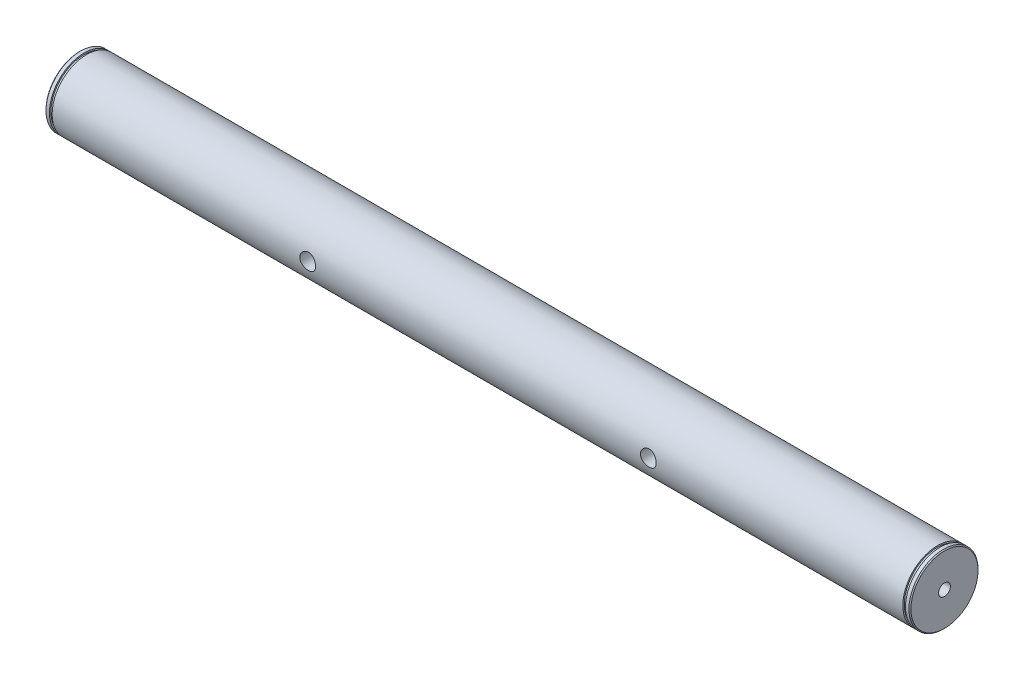
ISO-10303-21;
HEADER;
FILE_DESCRIPTION(('STEP AP214'),'2;1');
FILE_NAME('part.step','',(''),(''),'','','');
FILE_SCHEMA(('AUTOMOTIVE_DESIGN { 1 0 10303 214 1 1 1 1 }'));
ENDSEC;
DATA;
#1=APPLICATION_CONTEXT('core data for automotive mechanical design processes');
#2=APPLICATION_PROTOCOL_DEFINITION('international standard','automotive_design',2000,#1);
#3=PRODUCT_CONTEXT('',#1,'mechanical');
#4=PRODUCT('Part','Part','',(#3));
#5=PRODUCT_RELATED_PRODUCT_CATEGORY('part','',(#4));
#6=PRODUCT_DEFINITION_FORMATION('','',#4);
#7=PRODUCT_DEFINITION_CONTEXT('part definition',#1,'design');
#8=PRODUCT_DEFINITION('design','',#6,#7);
#9=PRODUCT_DEFINITION_SHAPE('','',#8);
#10=(LENGTH_UNIT() NAMED_UNIT(*) SI_UNIT(.MILLI.,.METRE.));
#11=(NAMED_UNIT(*) PLANE_ANGLE_UNIT() SI_UNIT($,.RADIAN.));
#12=(NAMED_UNIT(*) SI_UNIT($,.STERADIAN.) SOLID_ANGLE_UNIT());
#13=UNCERTAINTY_MEASURE_WITH_UNIT(LENGTH_MEASURE(1.E-05),#10,'distance_accuracy_value','');
#14=(GEOMETRIC_REPRESENTATION_CONTEXT(3) GLOBAL_UNCERTAINTY_ASSIGNED_CONTEXT((#13)) GLOBAL_UNIT_ASSIGNED_CONTEXT((#10,
#11,#12)) REPRESENTATION_CONTEXT('',''));
#15=CARTESIAN_POINT('',(0.,0.,0.));
#16=DIRECTION('',(0.,0.,1.));
#17=DIRECTION('',(1.,0.,0.));
#18=AXIS2_PLACEMENT_3D('',#15,#16,#17);
#19=CARTESIAN_POINT('',(0.,0.,0.));
#20=DIRECTION('',(1.,0.,0.));
#21=DIRECTION('',(0.,0.,-1.00000000000001));
#22=AXIS2_PLACEMENT_3D('',#19,#20,#21);
#23=PLANE('',#22);
#24=CARTESIAN_POINT('',(0.,0.,0.));
#25=DIRECTION('',(1.,0.,0.));
#26=DIRECTION('',(0.,0.,-1.00000000000001));
#27=AXIS2_PLACEMENT_3D('',#24,#25,#26);
#28=CIRCLE('',#27,34.);
#29=CARTESIAN_POINT('',(0.,0.,-34.0000000000003));
#30=VERTEX_POINT('',#29);
#31=EDGE_CURVE('E46',#30,#30,#28,.F.);
#32=ORIENTED_EDGE('',*,*,#31,.T.);
#33=EDGE_LOOP('',(#32));
#34=FACE_BOUND('',#33,.T.);
#35=ADVANCED_FACE('F38',(#34),#23,.F.);
#36=CARTESIAN_POINT('',(0.,0.,0.));
#37=DIRECTION('',(-1.,0.,0.));
#38=DIRECTION('',(0.,0.,1.00000000000001));
#39=AXIS2_PLACEMENT_3D('',#36,#37,#38);
#40=CYLINDRICAL_SURFACE('',#39,35.);
#41=CARTESIAN_POINT('',(0.99999999999989,0.,0.));
#42=DIRECTION('',(1.,0.,0.));
#43=DIRECTION('',(0.,0.,-1.00000000000001));
#44=AXIS2_PLACEMENT_3D('',#41,#42,#43);
#45=CIRCLE('',#44,35.);
#46=CARTESIAN_POINT('',(0.99999999999989,0.,-35.0000000000003));
#47=VERTEX_POINT('',#46);
#48=EDGE_CURVE('E11',#47,#47,#45,.T.);
#49=ORIENTED_EDGE('',*,*,#48,.T.);
#50=EDGE_LOOP('',(#49));
#51=FACE_BOUND('',#50,.T.);
#52=CARTESIAN_POINT('',(4.49999999999995,0.,0.));
#53=DIRECTION('',(-1.,0.,0.));
#54=DIRECTION('',(0.,0.,1.00000000000001));
#55=AXIS2_PLACEMENT_3D('',#52,#53,#54);
#56=CIRCLE('',#55,35.);
#57=CARTESIAN_POINT('',(4.49999999999995,0.,35.0000000000003));
#58=VERTEX_POINT('',#57);
#59=EDGE_CURVE('E98',#58,#58,#56,.T.);
#60=ORIENTED_EDGE('',*,*,#59,.T.);
#61=EDGE_LOOP('',(#60));
#62=FACE_BOUND('',#61,.T.);
#63=ADVANCED_FACE('F155',(#51,#62),#40,.T.);
#64=CARTESIAN_POINT('',(4.49999999999995,35.0000000000001,4.44089209850063E-13));
#65=DIRECTION('',(-1.,0.,0.));
#66=DIRECTION('',(0.,0.,1.00000000000001));
#67=AXIS2_PLACEMENT_3D('',#64,#65,#66);
#68=PLANE('',#67);
#69=ORIENTED_EDGE('',*,*,#59,.F.);
#70=EDGE_LOOP('',(#69));
#71=FACE_BOUND('',#70,.T.);
#72=CARTESIAN_POINT('',(4.49999999999995,0.,0.));
#73=DIRECTION('',(-1.,0.,0.));
#74=DIRECTION('',(0.,0.,1.00000000000001));
#75=AXIS2_PLACEMENT_3D('',#72,#73,#74);
#76=CIRCLE('',#75,33.5);
#77=CARTESIAN_POINT('',(4.49999999999995,0.,33.5000000000003));
#78=VERTEX_POINT('',#77);
#79=EDGE_CURVE('E95',#78,#78,#76,.T.);
#80=ORIENTED_EDGE('',*,*,#79,.T.);
#81=EDGE_LOOP('',(#80));
#82=FACE_BOUND('',#81,.T.);
#83=ADVANCED_FACE('F161',(#71,#82),#68,.F.);
#84=CARTESIAN_POINT('',(0.,0.,0.));
#85=DIRECTION('',(-1.,0.,0.));
#86=DIRECTION('',(0.,0.,1.00000000000001));
#87=AXIS2_PLACEMENT_3D('',#84,#85,#86);
#88=CYLINDRICAL_SURFACE('',#87,33.5);
#89=ORIENTED_EDGE('',*,*,#79,.F.);
#90=EDGE_LOOP('',(#89));
#91=FACE_BOUND('',#90,.T.);
#92=CARTESIAN_POINT('',(7.2000000000001,0.,0.));
#93=DIRECTION('',(-1.,0.,0.));
#94=DIRECTION('',(0.,0.,1.00000000000001));
#95=AXIS2_PLACEMENT_3D('',#92,#93,#94);
#96=CIRCLE('',#95,33.5);
#97=CARTESIAN_POINT('',(7.2000000000001,0.,33.5000000000003));
#98=VERTEX_POINT('',#97);
#99=EDGE_CURVE('E92',#98,#98,#96,.T.);
#100=ORIENTED_EDGE('',*,*,#99,.T.);
#101=EDGE_LOOP('',(#100));
#102=FACE_BOUND('',#101,.T.);
#103=ADVANCED_FACE('F278',(#91,#102),#88,.T.);
#104=CARTESIAN_POINT('',(7.19999999999987,33.5000000000001,4.44089209850063E-13));
#105=DIRECTION('',(1.,0.,0.));
#106=DIRECTION('',(0.,0.,-1.00000000000001));
#107=AXIS2_PLACEMENT_3D('',#104,#105,#106);
#108=PLANE('',#107);
#109=ORIENTED_EDGE('',*,*,#99,.F.);
#110=EDGE_LOOP('',(#109));
#111=FACE_BOUND('',#110,.T.);
#112=CARTESIAN_POINT('',(7.2000000000001,0.,0.));
#113=DIRECTION('',(-1.,0.,0.));
#114=DIRECTION('',(0.,0.,1.00000000000001));
#115=AXIS2_PLACEMENT_3D('',#112,#113,#114);
#116=CIRCLE('',#115,35.);
#117=CARTESIAN_POINT('',(7.2000000000001,0.,35.0000000000003));
#118=VERTEX_POINT('',#117);
#119=EDGE_CURVE('E89',#118,#118,#116,.T.);
#120=ORIENTED_EDGE('',*,*,#119,.T.);
#121=EDGE_LOOP('',(#120));
#122=FACE_BOUND('',#121,.T.);
#123=ADVANCED_FACE('F150',(#111,#122),#108,.F.);
#124=CARTESIAN_POINT('',(0.,0.,0.));
#125=DIRECTION('',(-1.,0.,0.));
#126=DIRECTION('',(0.,0.,1.00000000000001));
#127=AXIS2_PLACEMENT_3D('',#124,#125,#126);
#128=CYLINDRICAL_SURFACE('',#127,35.);
#129=CARTESIAN_POINT('',(274.,0.,35.0000000000004));
#130=CARTESIAN_POINT('',(274.000005553859,-0.221667544684847,35.0000031405337));
#131=CARTESIAN_POINT('',(273.990785059781,-0.443270533472379,34.9978907799102));
#132=CARTESIAN_POINT('',(273.953990760757,-0.884932773085318,34.9895071997101));
#133=CARTESIAN_POINT('',(273.926414401685,-1.10499180477015,34.9832354013694));
#134=CARTESIAN_POINT('',(273.853112374509,-1.54199416790453,34.966700019129));
#135=CARTESIAN_POINT('',(273.807379382323,-1.75893620537326,34.9564348243938));
#136=CARTESIAN_POINT('',(273.69811629257,-2.18816448752817,34.9321936935881));
#137=CARTESIAN_POINT('',(273.634579639278,-2.40044898609208,34.9182163907316));
#138=CARTESIAN_POINT('',(273.49032355772,-2.81848801117179,34.8869603277151));
#139=CARTESIAN_POINT('',(273.409629780193,-3.02425176459326,34.8696864999274));
#140=CARTESIAN_POINT('',(273.231581973582,-3.42826079939796,34.8322867979768));
#141=CARTESIAN_POINT('',(273.134221711466,-3.62650323390434,34.8121598572754));
#142=CARTESIAN_POINT('',(272.923619147253,-4.01398826860708,34.7696113878596));
#143=CARTESIAN_POINT('',(272.810383908087,-4.20323482128956,34.7471908807674));
#144=CARTESIAN_POINT('',(272.568738607308,-4.5716771856499,34.7006378778352));
#145=CARTESIAN_POINT('',(272.440321622822,-4.7508683567255,34.6765046029935));
#146=CARTESIAN_POINT('',(272.167102647859,-5.10067289752143,34.6267936054889));
#147=CARTESIAN_POINT('',(272.022075895238,-5.27110837866567,34.6011991997619));
#148=CARTESIAN_POINT('',(271.718359956236,-5.59913384613911,34.54963473573));
#149=CARTESIAN_POINT('',(271.559676732727,-5.75672938088998,34.523664845454));
#150=CARTESIAN_POINT('',(271.229564176022,-6.05818833464859,34.4720431330809));
#151=CARTESIAN_POINT('',(271.058128456122,-6.20204478935766,34.4463914779683));
#152=CARTESIAN_POINT('',(270.703779216688,-6.47490904799498,34.3961450921359));
#153=CARTESIAN_POINT('',(270.520870020742,-6.60392239397409,34.3715499690964));
#154=CARTESIAN_POINT('',(270.142353171933,-6.84779020296909,34.3238023540607));
#155=CARTESIAN_POINT('',(269.946614662509,-6.96244600851716,34.3006719170933));
#156=CARTESIAN_POINT('',(269.545961806446,-7.17478490365133,34.2568856687574));
#157=CARTESIAN_POINT('',(269.341050777896,-7.27247406937494,34.2362289723125));
#158=CARTESIAN_POINT('',(268.923403364813,-7.45018242645013,34.1979977399625));
#159=CARTESIAN_POINT('',(268.710666336916,-7.53020016125732,34.1804234581458));
#160=CARTESIAN_POINT('',(268.278912200629,-7.67190844307085,34.1488959734406));
#161=CARTESIAN_POINT('',(268.059895216516,-7.73359935247918,34.1349426989496));
#162=CARTESIAN_POINT('',(267.620937664421,-7.83725431927495,34.1112917515762));
#163=CARTESIAN_POINT('',(267.40107535345,-7.8795343421396,34.101526101062));
#164=CARTESIAN_POINT('',(266.958438144541,-7.94553109383562,34.0862096287856));
#165=CARTESIAN_POINT('',(266.735663302859,-7.96924818068196,34.0806587257355));
#166=CARTESIAN_POINT('',(266.288868663758,-7.99791607130487,34.0739424817388));
#167=CARTESIAN_POINT('',(266.064849010272,-8.00286900130396,34.0727766439075));
#168=CARTESIAN_POINT('',(265.617205546218,-7.99397164599208,34.074865203099));
#169=CARTESIAN_POINT('',(265.393581731201,-7.98012157333281,34.0781195501318));
#170=CARTESIAN_POINT('',(264.952890519958,-7.93420738908199,34.0888382382268));
#171=CARTESIAN_POINT('',(264.735781953916,-7.90251702190282,34.0962161703215));
#172=CARTESIAN_POINT('',(264.304990233605,-7.82144465317078,34.1149048382506));
#173=CARTESIAN_POINT('',(264.091308266041,-7.7720566551265,34.126216907051));
#174=CARTESIAN_POINT('',(263.668992109725,-7.65600048439017,34.1524404677331));
#175=CARTESIAN_POINT('',(263.460356347397,-7.58933777651406,34.1673508212033));
#176=CARTESIAN_POINT('',(263.049395514043,-7.43920757507283,34.2003522601358));
#177=CARTESIAN_POINT('',(262.847072834324,-7.35573380085419,34.21844453405));
#178=CARTESIAN_POINT('',(262.448516184232,-7.17185638632197,34.2574572406813));
#179=CARTESIAN_POINT('',(262.252346182332,-7.07131881209011,34.2783997651877));
#180=CARTESIAN_POINT('',(261.869080585712,-6.85448758594208,34.3224159454652));
#181=CARTESIAN_POINT('',(261.68198815036,-6.73818850103619,34.3454903352132));
#182=CARTESIAN_POINT('',(261.318162771684,-6.49067073074459,34.3931253295499));
#183=CARTESIAN_POINT('',(261.141429342205,-6.35945274636414,34.4176858642828));
#184=CARTESIAN_POINT('',(260.799438094507,-6.08296872512798,34.4676256900046));
#185=CARTESIAN_POINT('',(260.634180460434,-5.93770246293597,34.4930049941224));
#186=CARTESIAN_POINT('',(260.312396949673,-5.63043811889335,34.5445075381325));
#187=CARTESIAN_POINT('',(260.156173902634,-5.46812327491699,34.5706340683995));
#188=CARTESIAN_POINT('',(259.857976164136,-5.13090504767785,34.6222889702105));
#189=CARTESIAN_POINT('',(259.715996720026,-4.95600589708377,34.6478175390817));
#190=CARTESIAN_POINT('',(259.447155696683,-4.59466654680418,34.6975835767431));
#191=CARTESIAN_POINT('',(259.32030010477,-4.40822182047683,34.7218205321159));
#192=CARTESIAN_POINT('',(259.08272620278,-4.02518238036571,34.7683060586246));
#193=CARTESIAN_POINT('',(258.972001701058,-3.8285916004194,34.7905553914006));
#194=CARTESIAN_POINT('',(258.767157795362,-3.42595377119491,34.8325124220251));
#195=CARTESIAN_POINT('',(258.67308737973,-3.21988099914785,34.8522125771334));
#196=CARTESIAN_POINT('',(258.502708992976,-2.8003338495381,34.8884284665718));
#197=CARTESIAN_POINT('',(258.426394507905,-2.58686221945081,34.9049453683286));
#198=CARTESIAN_POINT('',(258.292096070064,-2.15396785400395,34.9343310472758));
#199=CARTESIAN_POINT('',(258.234113150036,-1.93454478411474,34.9471996189264));
#200=CARTESIAN_POINT('',(258.136969242473,-1.4913761750365,34.9689148725269));
#201=CARTESIAN_POINT('',(258.097807871233,-1.26763072406237,34.9777616364671));
#202=CARTESIAN_POINT('',(258.039280864824,-0.822362150840713,34.991031073781));
#203=CARTESIAN_POINT('',(258.019505690815,-0.600895508310848,34.9955452295444));
#204=CARTESIAN_POINT('',(257.9984564585,-0.157039937004364,35.0003513206167));
#205=CARTESIAN_POINT('',(257.997182161642,0.0653489798433742,35.0006433103668));
#206=CARTESIAN_POINT('',(258.013144545864,0.509410099602832,34.9969970212994));
#207=CARTESIAN_POINT('',(258.030379934771,0.731082351461898,34.993059037779));
#208=CARTESIAN_POINT('',(258.083215618151,1.17211331474241,34.9810636523709));
#209=CARTESIAN_POINT('',(258.118815858379,1.39147203299554,34.9730062626509));
#210=CARTESIAN_POINT('',(258.207537750854,1.82361991295457,34.9531204053794));
#211=CARTESIAN_POINT('',(258.260438435185,2.03645669779689,34.9413395558861));
#212=CARTESIAN_POINT('',(258.383474889933,2.45693868200991,34.9142929870124));
#213=CARTESIAN_POINT('',(258.453616515984,2.66458209107259,34.8990260837698));
#214=CARTESIAN_POINT('',(258.610569780837,3.07314124034413,34.8654242545123));
#215=CARTESIAN_POINT('',(258.697376618798,3.27405889854949,34.8470902122604));
#216=CARTESIAN_POINT('',(258.887072361402,3.66797890049605,34.8078314459218));
#217=CARTESIAN_POINT('',(258.989967275942,3.86097825210672,34.7869057543028));
#218=CARTESIAN_POINT('',(259.212750823746,4.24056622339775,34.7426921542221));
#219=CARTESIAN_POINT('',(259.332871228648,4.42701524214305,34.7193735186417));
#220=CARTESIAN_POINT('',(259.588112853727,4.78923902048882,34.6712645918226));
#221=CARTESIAN_POINT('',(259.723239274499,4.96501004659122,34.6464737917735));
#222=CARTESIAN_POINT('',(260.007538735608,5.30466335439696,34.5960984327957));
#223=CARTESIAN_POINT('',(260.156711168422,5.46854614975279,34.5705139082296));
#224=CARTESIAN_POINT('',(260.468123517354,5.78336986815578,34.5192421047331));
#225=CARTESIAN_POINT('',(260.630363547794,5.93431067795708,34.4935548249055));
#226=CARTESIAN_POINT('',(260.97030435335,6.22520873468774,34.4422566002848));
#227=CARTESIAN_POINT('',(261.148253582421,6.36487798931997,34.4166579757553));
#228=CARTESIAN_POINT('',(261.515401152284,6.62868415095115,34.3668236379923));
#229=CARTESIAN_POINT('',(261.704595584685,6.75282640849387,34.3425874568599));
#230=CARTESIAN_POINT('',(262.093076653697,6.9847796164483,34.2961638492234));
#231=CARTESIAN_POINT('',(262.292366765443,7.0925848916749,34.2739771357093));
#232=CARTESIAN_POINT('',(262.699525493014,7.29096216362651,34.2323260349487));
#233=CARTESIAN_POINT('',(262.907390675807,7.38154097703591,34.2128605716874));
#234=CARTESIAN_POINT('',(263.329149929899,7.54436058235985,34.1773248556515));
#235=CARTESIAN_POINT('',(263.543004733464,7.61669911968312,34.1612365866011));
#236=CARTESIAN_POINT('',(263.976214317934,7.7430730823793,34.1328143834861));
#237=CARTESIAN_POINT('',(264.195566977513,7.79711545395357,34.120479024797));
#238=CARTESIAN_POINT('',(264.638253819071,7.88648455535244,34.0999335417393));
#239=CARTESIAN_POINT('',(264.8615881619,7.92181052729636,34.0917235844207));
#240=CARTESIAN_POINT('',(265.310560876806,7.97343910469726,34.0796856656409));
#241=CARTESIAN_POINT('',(265.53619920414,7.98974207886264,34.0758576192484));
#242=CARTESIAN_POINT('',(265.982629914797,8.00302203784669,34.0727410170768));
#243=CARTESIAN_POINT('',(266.203408116193,8.00045505221597,34.0733453435119));
#244=CARTESIAN_POINT('',(266.644021721319,7.97708739571803,34.0788236412868));
#245=CARTESIAN_POINT('',(266.863856772373,7.95628041567231,34.0836990899991));
#246=CARTESIAN_POINT('',(267.300841695691,7.8966082973849,34.097573408055));
#247=CARTESIAN_POINT('',(267.517992569762,7.85775011891146,34.1065706881786));
#248=CARTESIAN_POINT('',(267.948239585832,7.76227659843508,34.1284259437195));
#249=CARTESIAN_POINT('',(268.161334190245,7.70565465961723,34.1412853533154));
#250=CARTESIAN_POINT('',(268.580984423175,7.57539291853326,34.1704236360512));
#251=CARTESIAN_POINT('',(268.787564611452,7.50182876752485,34.1866872798443));
#252=CARTESIAN_POINT('',(269.193778885516,7.33810148741419,34.2222044670479));
#253=CARTESIAN_POINT('',(269.393412704889,7.2479377224976,34.2414581249803));
#254=CARTESIAN_POINT('',(269.784431279276,7.0516621229436,34.2824168709962));
#255=CARTESIAN_POINT('',(269.975815489355,6.94554923684447,34.3041221206799));
#256=CARTESIAN_POINT('',(270.349096111794,6.71811962745283,34.34938582442));
#257=CARTESIAN_POINT('',(270.530992350763,6.59680262644602,34.3729443123243));
#258=CARTESIAN_POINT('',(270.888037039059,6.33694812202023,34.4218091184178));
#259=CARTESIAN_POINT('',(271.062948690542,6.19809023643323,34.4471425014352));
#260=CARTESIAN_POINT('',(271.400508051864,5.9062921517684,34.4983716891595));
#261=CARTESIAN_POINT('',(271.563155854487,5.75335205925035,34.5242674896095));
#262=CARTESIAN_POINT('',(271.875183557791,5.43433722395561,34.5759178104585));
#263=CARTESIAN_POINT('',(272.024557845781,5.26825698046519,34.6016722668122));
#264=CARTESIAN_POINT('',(272.308905994109,4.92417500194866,34.6523119528221));
#265=CARTESIAN_POINT('',(272.4438850896,4.74617763946451,34.6771974962495));
#266=CARTESIAN_POINT('',(272.700471337641,4.37664566402244,34.7257858850864));
#267=CARTESIAN_POINT('',(272.82184981301,4.18494911500734,34.7494656422426));
#268=CARTESIAN_POINT('',(273.047947312442,3.79181261534407,34.7945583447527));
#269=CARTESIAN_POINT('',(273.152672470559,3.5903762880477,34.8159721237763));
#270=CARTESIAN_POINT('',(273.344670888625,3.17919057824799,34.855922961164));
#271=CARTESIAN_POINT('',(273.43195308035,2.96944551655298,34.8744614907224));
#272=CARTESIAN_POINT('',(273.588420664456,2.54311945414203,34.9081411221465));
#273=CARTESIAN_POINT('',(273.657609136304,2.32653962371316,34.923282802078));
#274=CARTESIAN_POINT('',(273.810961743392,1.76485339970474,34.9571542524759));
#275=CARTESIAN_POINT('',(273.881740541058,1.41582705866949,34.9731290517636));
#276=CARTESIAN_POINT('',(273.976253981509,0.711144902666874,34.9945491309779));
#277=CARTESIAN_POINT('',(273.999991093246,0.355489436613866,34.9999949635101));
#278=CARTESIAN_POINT('',(274.,0.,35.0000000000004));
#279=B_SPLINE_CURVE_WITH_KNOTS('',3,(#129,#130,#131,#132,#133,#134,#135,#136,#137,#138,#139,
#140,#141,#142,#143,#144,#145,#146,#147,#148,#149,#150,#151,#152,#153,#154,#155,#156,#157,#158,
#159,#160,#161,#162,#163,#164,#165,#166,#167,#168,#169,#170,#171,#172,#173,#174,#175,#176,#177,
#178,#179,#180,#181,#182,#183,#184,#185,#186,#187,#188,#189,#190,#191,#192,#193,#194,#195,#196,
#197,#198,#199,#200,#201,#202,#203,#204,#205,#206,#207,#208,#209,#210,#211,#212,#213,#214,#215,
#216,#217,#218,#219,#220,#221,#222,#223,#224,#225,#226,#227,#228,#229,#230,#231,#232,#233,#234,
#235,#236,#237,#238,#239,#240,#241,#242,#243,#244,#245,#246,#247,#248,#249,#250,#251,#252,#253,
#254,#255,#256,#257,#258,#259,#260,#261,#262,#263,#264,#265,#266,#267,#268,#269,#270,#271,#272,
#273,#274,#275,#276,#277,#278),.UNSPECIFIED.,.T.,.F.,(4,2,2,2,2,2,2,2,2,2,2,2,2,2,2,2,2,2,2,2,2,
2,2,2,2,2,2,2,2,2,2,2,2,2,2,2,2,2,2,2,2,2,2,2,2,2,2,2,2,2,2,2,2,2,2,2,2,2,2,2,2,2,2,2,2,2,2,2,2,
2,2,2,2,2,4),(0.,0.664689892304383,1.32947229219034,1.99452312706528,2.65981917176691,
3.32412747374376,3.9886847627007,4.65294731655696,5.31751395100718,5.99246971599416,
6.66713225359355,7.34213498044272,8.01688485434049,8.70012779296676,9.38312554003485,
10.0661795612978,10.7492200746774,11.4207094124081,12.0921857991084,12.7635860965427,
13.4349788008688,14.0928033129048,14.750850926821,15.4086906224352,16.0667765459444,
16.7302893069714,17.3940313652091,18.0577422485913,18.7214637797539,19.4010380307176,
20.0803847692299,20.7599995646957,21.4393528103708,22.1206723346152,22.8017415141702,
23.4828490561979,24.1639427122512,24.8303163905621,25.496681476576,26.1630000462246,
26.8293166477328,27.4874350708745,28.1457773239634,28.8039302085404,29.4623295441596,
30.1306056847604,30.7991141551207,31.4675937241395,32.1360791419378,32.8182450056323,
33.5001751461067,34.1823416369488,34.8642376234058,35.5423978746593,36.2203003705917,
36.8982303146428,37.5761471186719,38.2377355562697,38.8995529263538,39.5611153395466,
40.2229237243716,40.8818323773581,41.5407662737494,42.1997436300846,42.8587330248789,
43.5322339731661,44.205729825504,44.8795091229267,45.5530425428539,46.2365910262593,
46.919887146469,47.6028324791892,48.2856615020068,49.3516842172126,50.4176509814232),.UNSPECIFIED.);
#280=CARTESIAN_POINT('',(274.,0.,35.0000000000004));
#281=VERTEX_POINT('',#280);
#282=EDGE_CURVE('E109',#281,#281,#279,.T.);
#283=ORIENTED_EDGE('',*,*,#282,.T.);
#284=EDGE_LOOP('',(#283));
#285=FACE_BOUND('',#284,.T.);
#286=CARTESIAN_POINT('',(619.,0.,35.));
#287=CARTESIAN_POINT('',(619.000005553859,-0.221667544684805,35.0000031405334));
#288=CARTESIAN_POINT('',(618.990785059781,-0.44327053347231,34.9978907799101));
#289=CARTESIAN_POINT('',(618.953990760757,-0.884932773085243,34.9895071997102));
#290=CARTESIAN_POINT('',(618.926414401685,-1.10499180477009,34.9832354013694));
#291=CARTESIAN_POINT('',(618.853112374508,-1.54199416790445,34.966700019129));
#292=CARTESIAN_POINT('',(618.807379382322,-1.75893620537314,34.9564348243939));
#293=CARTESIAN_POINT('',(618.69811629257,-2.18816448752811,34.932193693588));
#294=CARTESIAN_POINT('',(618.634579639278,-2.40044898609213,34.9182163907313));
#295=CARTESIAN_POINT('',(618.49032355772,-2.81848801117178,34.8869603277148));
#296=CARTESIAN_POINT('',(618.409629780193,-3.02425176459309,34.8696864999273));
#297=CARTESIAN_POINT('',(618.231581973581,-3.42826079939768,34.8322867979769));
#298=CARTESIAN_POINT('',(618.134221711465,-3.62650323390413,34.8121598572754));
#299=CARTESIAN_POINT('',(617.923619147253,-4.01398826860693,34.7696113878596));
#300=CARTESIAN_POINT('',(617.810383908086,-4.2032348212894,34.7471908807675));
#301=CARTESIAN_POINT('',(617.568738607308,-4.57167718564981,34.7006378778351));
#302=CARTESIAN_POINT('',(617.440321622821,-4.75086835672549,34.6765046029931));
#303=CARTESIAN_POINT('',(617.167102647859,-5.10067289752141,34.6267936054884));
#304=CARTESIAN_POINT('',(617.022075895237,-5.27110837866556,34.6011991997618));
#305=CARTESIAN_POINT('',(616.718359956235,-5.59913384613891,34.5496347357302));
#306=CARTESIAN_POINT('',(616.559676732727,-5.75672938088978,34.5236648454541));
#307=CARTESIAN_POINT('',(616.229564176021,-6.05818833464829,34.4720431330809));
#308=CARTESIAN_POINT('',(616.058128456122,-6.20204478935724,34.4463914779683));
#309=CARTESIAN_POINT('',(615.703779216689,-6.47490904799473,34.396145092136));
#310=CARTESIAN_POINT('',(615.520870020743,-6.60392239397412,34.3715499690966));
#311=CARTESIAN_POINT('',(615.142353171933,-6.84779020296911,34.3238023540609));
#312=CARTESIAN_POINT('',(614.946614662509,-6.96244600851686,34.3006719170934));
#313=CARTESIAN_POINT('',(614.545961806446,-7.17478490365082,34.2568856687574));
#314=CARTESIAN_POINT('',(614.341050777896,-7.27247406937454,34.2362289723127));
#315=CARTESIAN_POINT('',(613.923403364813,-7.4501824264498,34.1979977399626));
#316=CARTESIAN_POINT('',(613.710666336916,-7.53020016125696,34.1804234581457));
#317=CARTESIAN_POINT('',(613.27891220063,-7.67190844307064,34.1488959734409));
#318=CARTESIAN_POINT('',(613.059895216516,-7.73359935247916,34.1349426989503));
#319=CARTESIAN_POINT('',(612.620937664421,-7.83725431927499,34.111291751577));
#320=CARTESIAN_POINT('',(612.40107535345,-7.87953434213951,34.1015261010623));
#321=CARTESIAN_POINT('',(611.958438144541,-7.94553109383546,34.0862096287854));
#322=CARTESIAN_POINT('',(611.73566330286,-7.96924818068185,34.0806587257354));
#323=CARTESIAN_POINT('',(611.288868663758,-7.99791607130486,34.0739424817389));
#324=CARTESIAN_POINT('',(611.064849010272,-8.00286900130398,34.0727766439078));
#325=CARTESIAN_POINT('',(610.617205546218,-7.99397164599208,34.0748652030987));
#326=CARTESIAN_POINT('',(610.393581731202,-7.98012157333278,34.0781195501309));
#327=CARTESIAN_POINT('',(609.952890519958,-7.93420738908202,34.0888382382259));
#328=CARTESIAN_POINT('',(609.735781953916,-7.90251702190294,34.0962161703212));
#329=CARTESIAN_POINT('',(609.304990233606,-7.82144465317097,34.1149048382508));
#330=CARTESIAN_POINT('',(609.091308266042,-7.77205665512668,34.126216907051));
#331=CARTESIAN_POINT('',(608.668992109725,-7.65600048439044,34.152440467733));
#332=CARTESIAN_POINT('',(608.460356347397,-7.58933777651443,34.1673508212031));
#333=CARTESIAN_POINT('',(608.049395514043,-7.43920757507305,34.2003522601358));
#334=CARTESIAN_POINT('',(607.847072834324,-7.35573380085416,34.2184445340502));
#335=CARTESIAN_POINT('',(607.448516184232,-7.17185638632198,34.2574572406815));
#336=CARTESIAN_POINT('',(607.252346182332,-7.0713188120904,34.2783997651877));
#337=CARTESIAN_POINT('',(606.869080585712,-6.85448758594257,34.322415945465));
#338=CARTESIAN_POINT('',(606.68198815036,-6.73818850103662,34.3454903352131));
#339=CARTESIAN_POINT('',(606.318162771684,-6.49067073074508,34.3931253295498));
#340=CARTESIAN_POINT('',(606.141429342205,-6.35945274636475,34.4176858642825));
#341=CARTESIAN_POINT('',(605.799438094507,-6.08296872512837,34.4676256900046));
#342=CARTESIAN_POINT('',(605.634180460434,-5.93770246293599,34.4930049941227));
#343=CARTESIAN_POINT('',(605.312396949674,-5.63043811889334,34.5445075381328));
#344=CARTESIAN_POINT('',(605.156173902634,-5.4681232749173,34.5706340683995));
#345=CARTESIAN_POINT('',(604.857976164135,-5.13090504767834,34.6222889702103));
#346=CARTESIAN_POINT('',(604.715996720025,-4.95600589708411,34.6478175390817));
#347=CARTESIAN_POINT('',(604.447155696682,-4.59466654680434,34.6975835767431));
#348=CARTESIAN_POINT('',(604.320300104769,-4.40822182047697,34.7218205321157));
#349=CARTESIAN_POINT('',(604.082726202779,-4.02518238036577,34.7683060586247));
#350=CARTESIAN_POINT('',(603.972001701058,-3.82859160041942,34.7905553914011));
#351=CARTESIAN_POINT('',(603.767157795362,-3.4259537711949,34.8325124220255));
#352=CARTESIAN_POINT('',(603.67308737973,-3.21988099914785,34.8522125771335));
#353=CARTESIAN_POINT('',(603.502708992976,-2.8003338495381,34.8884284665717));
#354=CARTESIAN_POINT('',(603.426394507905,-2.58686221945081,34.9049453683286));
#355=CARTESIAN_POINT('',(603.292096070063,-2.15396785400395,34.9343310472758));
#356=CARTESIAN_POINT('',(603.234113150035,-1.93454478411473,34.9471996189263));
#357=CARTESIAN_POINT('',(603.136969242473,-1.4913761750365,34.968914872527));
#358=CARTESIAN_POINT('',(603.097807871233,-1.26763072406237,34.9777616364676));
#359=CARTESIAN_POINT('',(603.039280864823,-0.822362150840714,34.9910310737815));
#360=CARTESIAN_POINT('',(603.019505690814,-0.600895508310849,34.9955452295445));
#361=CARTESIAN_POINT('',(602.998456458499,-0.157039937004365,35.0003513206166));
#362=CARTESIAN_POINT('',(602.997182161641,0.0653489798433723,35.0006433103668));
#363=CARTESIAN_POINT('',(603.013144545864,0.509410099602834,34.9969970212994));
#364=CARTESIAN_POINT('',(603.030379934771,0.731082351461904,34.993059037779));
#365=CARTESIAN_POINT('',(603.083215618151,1.17211331474241,34.981063652371));
#366=CARTESIAN_POINT('',(603.118815858378,1.39147203299553,34.9730062626512));
#367=CARTESIAN_POINT('',(603.207537750854,1.82361991295457,34.9531204053796));
#368=CARTESIAN_POINT('',(603.260438435185,2.03645669779691,34.9413395558862));
#369=CARTESIAN_POINT('',(603.383474889932,2.45693868200992,34.9142929870123));
#370=CARTESIAN_POINT('',(603.453616515984,2.66458209107257,34.8990260837698));
#371=CARTESIAN_POINT('',(603.610569780836,3.07314124034411,34.8654242545123));
#372=CARTESIAN_POINT('',(603.697376618797,3.27405889854949,34.8470902122603));
#373=CARTESIAN_POINT('',(603.887072361401,3.66797890049606,34.8078314459218));
#374=CARTESIAN_POINT('',(603.989967275942,3.86097825210673,34.786905754303));
#375=CARTESIAN_POINT('',(604.212750823746,4.24056622339779,34.7426921542224));
#376=CARTESIAN_POINT('',(604.332871228648,4.42701524214314,34.7193735186417));
#377=CARTESIAN_POINT('',(604.588112853726,4.78923902048895,34.6712645918225));
#378=CARTESIAN_POINT('',(604.723239274498,4.96501004659134,34.6464737917734));
#379=CARTESIAN_POINT('',(605.007538735608,5.30466335439719,34.5960984327957));
#380=CARTESIAN_POINT('',(605.156711168421,5.46854614975314,34.5705139082296));
#381=CARTESIAN_POINT('',(605.468123517354,5.78336986815599,34.519242104733));
#382=CARTESIAN_POINT('',(605.630363547794,5.93431067795704,34.4935548249055));
#383=CARTESIAN_POINT('',(605.97030435335,6.22520873468773,34.4422566002848));
#384=CARTESIAN_POINT('',(606.148253582421,6.36487798932025,34.4166579757552));
#385=CARTESIAN_POINT('',(606.515401152284,6.62868415095163,34.3668236379922));
#386=CARTESIAN_POINT('',(606.704595584685,6.75282640849425,34.3425874568598));
#387=CARTESIAN_POINT('',(607.093076653697,6.98477961644864,34.2961638492234));
#388=CARTESIAN_POINT('',(607.292366765443,7.0925848916753,34.2739771357092));
#389=CARTESIAN_POINT('',(607.699525493014,7.29096216362675,34.2323260349487));
#390=CARTESIAN_POINT('',(607.907390675808,7.38154097703592,34.2128605716873));
#391=CARTESIAN_POINT('',(608.3291499299,7.54436058235984,34.1773248556514));
#392=CARTESIAN_POINT('',(608.543004733464,7.61669911968332,34.1612365866011));
#393=CARTESIAN_POINT('',(608.976214317935,7.74307308237963,34.132814383486));
#394=CARTESIAN_POINT('',(609.195566977514,7.79711545395382,34.1204790247969));
#395=CARTESIAN_POINT('',(609.638253819071,7.88648455535261,34.0999335417393));
#396=CARTESIAN_POINT('',(609.861588161901,7.92181052729652,34.0917235844209));
#397=CARTESIAN_POINT('',(610.310560876806,7.97343910469735,34.0796856656406));
#398=CARTESIAN_POINT('',(610.536199204141,7.98974207886267,34.0758576192475));
#399=CARTESIAN_POINT('',(610.982629914797,8.00302203784665,34.0727410170759));
#400=CARTESIAN_POINT('',(611.203408116193,8.00045505221593,34.0733453435116));
#401=CARTESIAN_POINT('',(611.644021721319,7.97708739571797,34.078823641287));
#402=CARTESIAN_POINT('',(611.863856772373,7.95628041567223,34.0836990899992));
#403=CARTESIAN_POINT('',(612.300841695692,7.89660829738475,34.0975734080549));
#404=CARTESIAN_POINT('',(612.517992569763,7.85775011891125,34.1065706881784));
#405=CARTESIAN_POINT('',(612.948239585832,7.76227659843496,34.1284259437197));
#406=CARTESIAN_POINT('',(613.161334190246,7.70565465961726,34.1412853533162));
#407=CARTESIAN_POINT('',(613.580984423176,7.57539291853323,34.170423636052));
#408=CARTESIAN_POINT('',(613.787564611452,7.50182876752461,34.1866872798445));
#409=CARTESIAN_POINT('',(614.193778885516,7.3381014874138,34.2222044670477));
#410=CARTESIAN_POINT('',(614.393412704889,7.24793772249727,34.2414581249803));
#411=CARTESIAN_POINT('',(614.784431279276,7.05166212294324,34.2824168709964));
#412=CARTESIAN_POINT('',(614.975815489355,6.94554923684401,34.3041221206801));
#413=CARTESIAN_POINT('',(615.349096111794,6.71811962745254,34.3493858244199));
#414=CARTESIAN_POINT('',(615.530992350763,6.59680262644599,34.3729443123239));
#415=CARTESIAN_POINT('',(615.888037039059,6.33694812202024,34.4218091184174));
#416=CARTESIAN_POINT('',(616.062948690542,6.198090236433,34.4471425014351));
#417=CARTESIAN_POINT('',(616.400508051864,5.90629215176805,34.4983716891596));
#418=CARTESIAN_POINT('',(616.563155854487,5.75335205925013,34.5242674896095));
#419=CARTESIAN_POINT('',(616.87518355779,5.43433722395549,34.5759178104585));
#420=CARTESIAN_POINT('',(617.024557845781,5.26825698046504,34.6016722668123));
#421=CARTESIAN_POINT('',(617.308905994108,4.92417500194855,34.652311952822));
#422=CARTESIAN_POINT('',(617.4438850896,4.74617763946447,34.6771974962491));
#423=CARTESIAN_POINT('',(617.700471337641,4.37664566402247,34.7257858850859));
#424=CARTESIAN_POINT('',(617.82184981301,4.18494911500736,34.7494656422424));
#425=CARTESIAN_POINT('',(618.047947312441,3.79181261534415,34.7945583447528));
#426=CARTESIAN_POINT('',(618.152672470558,3.59037628804782,34.8159721237763));
#427=CARTESIAN_POINT('',(618.344670888624,3.1791905782482,34.8559229611639));
#428=CARTESIAN_POINT('',(618.431953080349,2.96944551655323,34.8744614907224));
#429=CARTESIAN_POINT('',(618.588420664455,2.54311945414254,34.9081411221464));
#430=CARTESIAN_POINT('',(618.657609136304,2.32653962371391,34.9232828020777));
#431=CARTESIAN_POINT('',(618.810961743392,1.7648533997056,34.9571542524755));
#432=CARTESIAN_POINT('',(618.881740541057,1.41582705867007,34.9731290517636));
#433=CARTESIAN_POINT('',(618.976253981508,0.71114490266709,34.9945491309779));
#434=CARTESIAN_POINT('',(618.999991093247,0.35548943661399,34.9999949635097));
#435=CARTESIAN_POINT('',(619.,0.,35.));
#436=B_SPLINE_CURVE_WITH_KNOTS('',3,(#286,#287,#288,#289,#290,#291,#292,#293,#294,#295,#296,
#297,#298,#299,#300,#301,#302,#303,#304,#305,#306,#307,#308,#309,#310,#311,#312,#313,#314,#315,
#316,#317,#318,#319,#320,#321,#322,#323,#324,#325,#326,#327,#328,#329,#330,#331,#332,#333,#334,
#335,#336,#337,#338,#339,#340,#341,#342,#343,#344,#345,#346,#347,#348,#349,#350,#351,#352,#353,
#354,#355,#356,#357,#358,#359,#360,#361,#362,#363,#364,#365,#366,#367,#368,#369,#370,#371,#372,
#373,#374,#375,#376,#377,#378,#379,#380,#381,#382,#383,#384,#385,#386,#387,#388,#389,#390,#391,
#392,#393,#394,#395,#396,#397,#398,#399,#400,#401,#402,#403,#404,#405,#406,#407,#408,#409,#410,
#411,#412,#413,#414,#415,#416,#417,#418,#419,#420,#421,#422,#423,#424,#425,#426,#427,#428,#429,
#430,#431,#432,#433,#434,#435),.UNSPECIFIED.,.T.,.F.,(4,2,2,2,2,2,2,2,2,2,2,2,2,2,2,2,2,2,2,2,2,
2,2,2,2,2,2,2,2,2,2,2,2,2,2,2,2,2,2,2,2,2,2,2,2,2,2,2,2,2,2,2,2,2,2,2,2,2,2,2,2,2,2,2,2,2,2,2,2,
2,2,2,2,2,4),(0.,0.664689892304316,1.32947229219032,1.99452312706523,2.65981917176673,
3.32412747374357,3.98868476270059,4.65294731655689,5.31751395100717,5.9924697159941,
6.66713225359329,7.34213498044229,8.01688485433973,8.70012779296595,9.383125540034,
10.0661795612971,10.7492200746767,11.4207094124075,12.0921857991077,12.763586096542,
13.434978800868,14.0928033129041,14.7508509268203,15.4086906224345,16.0667765459436,
16.7302893069708,17.3940313652084,18.0577422485906,18.7214637797533,19.4010380307171,
20.0803847692297,20.7599995646957,21.4393528103709,22.1206723346153,22.8017415141702,
23.4828490561979,24.1639427122512,24.8303163905622,25.496681476576,26.1630000462246,
26.8293166477329,27.4874350708745,28.1457773239634,28.8039302085404,29.4623295441596,
30.1306056847606,30.799114155121,31.4675937241399,32.1360791419384,32.8182450056329,
33.5001751461074,34.1823416369495,34.8642376234066,35.5423978746602,36.2203003705927,
36.8982303146439,37.5761471186729,38.2377355562706,38.8995529263546,39.5611153395474,
40.2229237243724,40.8818323773589,41.5407662737501,42.1997436300854,42.8587330248795,
43.5322339731666,44.2057298255043,44.8795091229269,45.5530425428539,46.2365910262593,
46.9198871464689,47.6028324791889,48.2856615020062,49.3516842172123,50.4176509814233),.UNSPECIFIED.);
#437=CARTESIAN_POINT('',(619.,0.,35.));
#438=VERTEX_POINT('',#437);
#439=EDGE_CURVE('E101',#438,#438,#436,.T.);
#440=ORIENTED_EDGE('',*,*,#439,.T.);
#441=EDGE_LOOP('',(#440));
#442=FACE_BOUND('',#441,.T.);
#443=ORIENTED_EDGE('',*,*,#119,.F.);
#444=EDGE_LOOP('',(#443));
#445=FACE_BOUND('',#444,.T.);
#446=CARTESIAN_POINT('',(868.800000000001,0.,0.));
#447=DIRECTION('',(-1.,0.,0.));
#448=DIRECTION('',(0.,0.,1.00000000000001));
#449=AXIS2_PLACEMENT_3D('',#446,#447,#448);
#450=CIRCLE('',#449,35.);
#451=CARTESIAN_POINT('',(868.800000000001,0.,35.0000000000003));
#452=VERTEX_POINT('',#451);
#453=EDGE_CURVE('E86',#452,#452,#450,.T.);
#454=ORIENTED_EDGE('',*,*,#453,.T.);
#455=EDGE_LOOP('',(#454));
#456=FACE_BOUND('',#455,.T.);
#457=ADVANCED_FACE('F115',(#285,#442,#445,#456),#128,.T.);
#458=CARTESIAN_POINT('',(868.800000000001,33.5000000000001,0.));
#459=DIRECTION('',(-1.,0.,0.));
#460=DIRECTION('',(0.,0.,1.00000000000001));
#461=AXIS2_PLACEMENT_3D('',#458,#459,#460);
#462=PLANE('',#461);
#463=ORIENTED_EDGE('',*,*,#453,.F.);
#464=EDGE_LOOP('',(#463));
#465=FACE_BOUND('',#464,.T.);
#466=CARTESIAN_POINT('',(868.800000000001,0.,0.));
#467=DIRECTION('',(-1.,0.,0.));
#468=DIRECTION('',(0.,0.,1.00000000000001));
#469=AXIS2_PLACEMENT_3D('',#466,#467,#468);
#470=CIRCLE('',#469,33.5);
#471=CARTESIAN_POINT('',(868.800000000001,0.,33.5000000000003));
#472=VERTEX_POINT('',#471);
#473=EDGE_CURVE('E83',#472,#472,#470,.T.);
#474=ORIENTED_EDGE('',*,*,#473,.T.);
#475=EDGE_LOOP('',(#474));
#476=FACE_BOUND('',#475,.T.);
#477=ADVANCED_FACE('F143',(#465,#476),#462,.F.);
#478=CARTESIAN_POINT('',(0.,0.,0.));
#479=DIRECTION('',(-1.,0.,0.));
#480=DIRECTION('',(0.,0.,1.00000000000001));
#481=AXIS2_PLACEMENT_3D('',#478,#479,#480);
#482=CYLINDRICAL_SURFACE('',#481,33.5);
#483=ORIENTED_EDGE('',*,*,#473,.F.);
#484=EDGE_LOOP('',(#483));
#485=FACE_BOUND('',#484,.T.);
#486=CARTESIAN_POINT('',(871.500000000001,0.,0.));
#487=DIRECTION('',(-1.,0.,0.));
#488=DIRECTION('',(0.,0.,1.00000000000001));
#489=AXIS2_PLACEMENT_3D('',#486,#487,#488);
#490=CIRCLE('',#489,33.5);
#491=CARTESIAN_POINT('',(871.500000000001,0.,33.5000000000003));
#492=VERTEX_POINT('',#491);
#493=EDGE_CURVE('E80',#492,#492,#490,.T.);
#494=ORIENTED_EDGE('',*,*,#493,.T.);
#495=EDGE_LOOP('',(#494));
#496=FACE_BOUND('',#495,.T.);
#497=ADVANCED_FACE('F140',(#485,#496),#482,.T.);
#498=CARTESIAN_POINT('',(871.500000000001,35.0000000000001,0.));
#499=DIRECTION('',(1.,0.,0.));
#500=DIRECTION('',(0.,0.,-1.00000000000001));
#501=AXIS2_PLACEMENT_3D('',#498,#499,#500);
#502=PLANE('',#501);
#503=ORIENTED_EDGE('',*,*,#493,.F.);
#504=EDGE_LOOP('',(#503));
#505=FACE_BOUND('',#504,.T.);
#506=CARTESIAN_POINT('',(871.500000000001,0.,0.));
#507=DIRECTION('',(-1.,0.,0.));
#508=DIRECTION('',(0.,0.,1.00000000000001));
#509=AXIS2_PLACEMENT_3D('',#506,#507,#508);
#510=CIRCLE('',#509,35.);
#511=CARTESIAN_POINT('',(871.500000000001,0.,35.0000000000003));
#512=VERTEX_POINT('',#511);
#513=EDGE_CURVE('E77',#512,#512,#510,.T.);
#514=ORIENTED_EDGE('',*,*,#513,.T.);
#515=EDGE_LOOP('',(#514));
#516=FACE_BOUND('',#515,.T.);
#517=ADVANCED_FACE('F136',(#505,#516),#502,.F.);
#518=CARTESIAN_POINT('',(0.,0.,0.));
#519=DIRECTION('',(-1.,0.,0.));
#520=DIRECTION('',(0.,0.,1.00000000000001));
#521=AXIS2_PLACEMENT_3D('',#518,#519,#520);
#522=CYLINDRICAL_SURFACE('',#521,35.);
#523=CARTESIAN_POINT('',(875.000000000001,0.,0.));
#524=DIRECTION('',(-1.,0.,0.));
#525=DIRECTION('',(0.,0.,1.00000000000001));
#526=AXIS2_PLACEMENT_3D('',#523,#524,#525);
#527=CIRCLE('',#526,35.);
#528=CARTESIAN_POINT('',(875.000000000001,0.,35.0000000000003));
#529=VERTEX_POINT('',#528);
#530=EDGE_CURVE('E181',#529,#529,#527,.T.);
#531=ORIENTED_EDGE('',*,*,#530,.T.);
#532=EDGE_LOOP('',(#531));
#533=FACE_BOUND('',#532,.T.);
#534=ORIENTED_EDGE('',*,*,#513,.F.);
#535=EDGE_LOOP('',(#534));
#536=FACE_BOUND('',#535,.T.);
#537=ADVANCED_FACE('F132',(#533,#536),#522,.T.);
#538=CARTESIAN_POINT('',(876.000000000001,35.0000000000001,0.));
#539=DIRECTION('',(-1.,0.,0.));
#540=DIRECTION('',(0.,0.,1.00000000000001));
#541=AXIS2_PLACEMENT_3D('',#538,#539,#540);
#542=PLANE('',#541);
#543=CARTESIAN_POINT('',(876.000000000001,0.,0.));
#544=DIRECTION('',(-1.,0.,0.));
#545=DIRECTION('',(0.,0.,1.00000000000001));
#546=AXIS2_PLACEMENT_3D('',#543,#544,#545);
#547=CIRCLE('',#546,33.9999999999999);
#548=CARTESIAN_POINT('',(876.000000000001,0.,34.0000000000002));
#549=VERTEX_POINT('',#548);
#550=EDGE_CURVE('E178',#549,#549,#547,.F.);
#551=ORIENTED_EDGE('',*,*,#550,.T.);
#552=EDGE_LOOP('',(#551));
#553=FACE_BOUND('',#552,.T.);
#554=CARTESIAN_POINT('',(876.000000000001,0.,0.));
#555=DIRECTION('',(1.,0.,0.));
#556=DIRECTION('',(0.,0.,-1.00000000000001));
#557=AXIS2_PLACEMENT_3D('',#554,#555,#556);
#558=CIRCLE('',#557,6.);
#559=CARTESIAN_POINT('',(876.000000000001,0.,-6.00000000000005));
#560=VERTEX_POINT('',#559);
#561=EDGE_CURVE('E67',#560,#560,#558,.T.);
#562=ORIENTED_EDGE('',*,*,#561,.F.);
#563=EDGE_LOOP('',(#562));
#564=FACE_BOUND('',#563,.T.);
#565=ADVANCED_FACE('F125',(#553,#564),#542,.F.);
#566=CARTESIAN_POINT('',(611.,0.,35.0000000000009));
#567=DIRECTION('',(0.,0.,1.00000000000001));
#568=DIRECTION('',(1.,0.,0.));
#569=AXIS2_PLACEMENT_3D('',#566,#567,#568);
#570=CYLINDRICAL_SURFACE('',#569,8.00000000000001);
#571=CARTESIAN_POINT('',(611.000000000001,0.,20.0000000000009));
#572=DIRECTION('',(0.,0.,1.00000000000001));
#573=DIRECTION('',(1.,0.,0.));
#574=AXIS2_PLACEMENT_3D('',#571,#572,#573);
#575=CIRCLE('',#574,8.00000000000001);
#576=CARTESIAN_POINT('',(619.000000000001,0.,20.0000000000009));
#577=VERTEX_POINT('',#576);
#578=EDGE_CURVE('E70',#577,#577,#575,.T.);
#579=ORIENTED_EDGE('',*,*,#578,.F.);
#580=EDGE_LOOP('',(#579));
#581=FACE_BOUND('',#580,.T.);
#582=ORIENTED_EDGE('',*,*,#439,.F.);
#583=EDGE_LOOP('',(#582));
#584=FACE_BOUND('',#583,.T.);
#585=ADVANCED_FACE('F119',(#581,#584),#570,.F.);
#586=CARTESIAN_POINT('',(611.000000000001,0.,20.0000000000009));
#587=DIRECTION('',(0.,0.,1.00000000000001));
#588=DIRECTION('',(1.,0.,0.));
#589=AXIS2_PLACEMENT_3D('',#586,#587,#588);
#590=CONICAL_SURFACE('',#589,8.00000000000001,1.02974425867665);
#591=CARTESIAN_POINT('',(611.,0.,15.1931150477805));
#592=VERTEX_POINT('',#591);
#593=VERTEX_LOOP('',#592);
#594=FACE_BOUND('',#593,.T.);
#595=ORIENTED_EDGE('',*,*,#578,.T.);
#596=EDGE_LOOP('',(#595));
#597=FACE_BOUND('',#596,.T.);
#598=ADVANCED_FACE('F124',(#594,#597),#590,.F.);
#599=CARTESIAN_POINT('',(266.,0.,35.0000000000009));
#600=DIRECTION('',(0.,0.,1.00000000000001));
#601=DIRECTION('',(1.,0.,0.));
#602=AXIS2_PLACEMENT_3D('',#599,#600,#601);
#603=CYLINDRICAL_SURFACE('',#602,8.00000000000001);
#604=CARTESIAN_POINT('',(266.,0.,20.0000000000009));
#605=DIRECTION('',(0.,0.,1.00000000000001));
#606=DIRECTION('',(1.,0.,0.));
#607=AXIS2_PLACEMENT_3D('',#604,#605,#606);
#608=CIRCLE('',#607,8.00000000000001);
#609=CARTESIAN_POINT('',(274.,0.,20.0000000000009));
#610=VERTEX_POINT('',#609);
#611=EDGE_CURVE('E66',#610,#610,#608,.T.);
#612=ORIENTED_EDGE('',*,*,#611,.F.);
#613=EDGE_LOOP('',(#612));
#614=FACE_BOUND('',#613,.T.);
#615=ORIENTED_EDGE('',*,*,#282,.F.);
#616=EDGE_LOOP('',(#615));
#617=FACE_BOUND('',#616,.T.);
#618=ADVANCED_FACE('F129',(#614,#617),#603,.F.);
#619=CARTESIAN_POINT('',(266.,0.,20.0000000000009));
#620=DIRECTION('',(0.,0.,1.00000000000001));
#621=DIRECTION('',(1.,0.,0.));
#622=AXIS2_PLACEMENT_3D('',#619,#620,#621);
#623=CONICAL_SURFACE('',#622,8.00000000000001,1.02974425867665);
#624=CARTESIAN_POINT('',(266.,0.,15.1931150477804));
#625=VERTEX_POINT('',#624);
#626=VERTEX_LOOP('',#625);
#627=FACE_BOUND('',#626,.T.);
#628=ORIENTED_EDGE('',*,*,#611,.T.);
#629=EDGE_LOOP('',(#628));
#630=FACE_BOUND('',#629,.T.);
#631=ADVANCED_FACE('F60',(#627,#630),#623,.F.);
#632=CARTESIAN_POINT('',(846.000000000001,0.,0.));
#633=DIRECTION('',(1.,0.,0.));
#634=DIRECTION('',(0.,0.,-1.00000000000001));
#635=AXIS2_PLACEMENT_3D('',#632,#633,#634);
#636=CONICAL_SURFACE('',#635,5.99999999999999,1.02974425867666);
#637=CARTESIAN_POINT('',(842.394836285836,0.,0.));
#638=VERTEX_POINT('',#637);
#639=VERTEX_LOOP('',#638);
#640=FACE_BOUND('',#639,.T.);
#641=CARTESIAN_POINT('',(846.000000000001,0.,0.));
#642=DIRECTION('',(1.,0.,0.));
#643=DIRECTION('',(0.,0.,-1.00000000000001));
#644=AXIS2_PLACEMENT_3D('',#641,#642,#643);
#645=CIRCLE('',#644,5.99999999999999);
#646=CARTESIAN_POINT('',(846.000000000001,0.,-6.00000000000005));
#647=VERTEX_POINT('',#646);
#648=EDGE_CURVE('E64',#647,#647,#645,.T.);
#649=ORIENTED_EDGE('',*,*,#648,.T.);
#650=EDGE_LOOP('',(#649));
#651=FACE_BOUND('',#650,.T.);
#652=ADVANCED_FACE('F56',(#640,#651),#636,.F.);
#653=CARTESIAN_POINT('',(876.000000000001,0.,0.));
#654=DIRECTION('',(1.,0.,0.));
#655=DIRECTION('',(0.,0.,-1.00000000000001));
#656=AXIS2_PLACEMENT_3D('',#653,#654,#655);
#657=CYLINDRICAL_SURFACE('',#656,5.99999999999999);
#658=ORIENTED_EDGE('',*,*,#648,.F.);
#659=EDGE_LOOP('',(#658));
#660=FACE_BOUND('',#659,.T.);
#661=ORIENTED_EDGE('',*,*,#561,.T.);
#662=EDGE_LOOP('',(#661));
#663=FACE_BOUND('',#662,.T.);
#664=ADVANCED_FACE('F59',(#660,#663),#657,.F.);
#665=CARTESIAN_POINT('',(875.000000000001,0.,0.));
#666=DIRECTION('',(-1.,0.,0.));
#667=DIRECTION('',(0.,0.,1.00000000000001));
#668=AXIS2_PLACEMENT_3D('',#665,#666,#667);
#669=CONICAL_SURFACE('',#668,35.,0.785398163397435);
#670=ORIENTED_EDGE('',*,*,#550,.F.);
#671=EDGE_LOOP('',(#670));
#672=FACE_BOUND('',#671,.T.);
#673=ORIENTED_EDGE('',*,*,#530,.F.);
#674=EDGE_LOOP('',(#673));
#675=FACE_BOUND('',#674,.T.);
#676=ADVANCED_FACE('F166',(#672,#675),#669,.T.);
#677=CARTESIAN_POINT('',(0.,0.,0.));
#678=DIRECTION('',(1.,0.,0.));
#679=DIRECTION('',(0.,0.,-1.00000000000001));
#680=AXIS2_PLACEMENT_3D('',#677,#678,#679);
#681=CONICAL_SURFACE('',#680,34.,0.785398163397435);
#682=ORIENTED_EDGE('',*,*,#48,.F.);
#683=EDGE_LOOP('',(#682));
#684=FACE_BOUND('',#683,.T.);
#685=ORIENTED_EDGE('',*,*,#31,.F.);
#686=EDGE_LOOP('',(#685));
#687=FACE_BOUND('',#686,.T.);
#688=ADVANCED_FACE('F40',(#684,#687),#681,.T.);
#689=CLOSED_SHELL('',(#35,#63,#83,#103,#123,#457,#477,#497,#517,#537,#565,#585,#598,#618,#631,
#652,#664,#676,#688));
#690=MANIFOLD_SOLID_BREP('B2',#689);
#691=ADVANCED_BREP_SHAPE_REPRESENTATION('',(#18,#690),#14);
#692=SHAPE_DEFINITION_REPRESENTATION(#9,#691);
ENDSEC;
END-ISO-10303-21;
